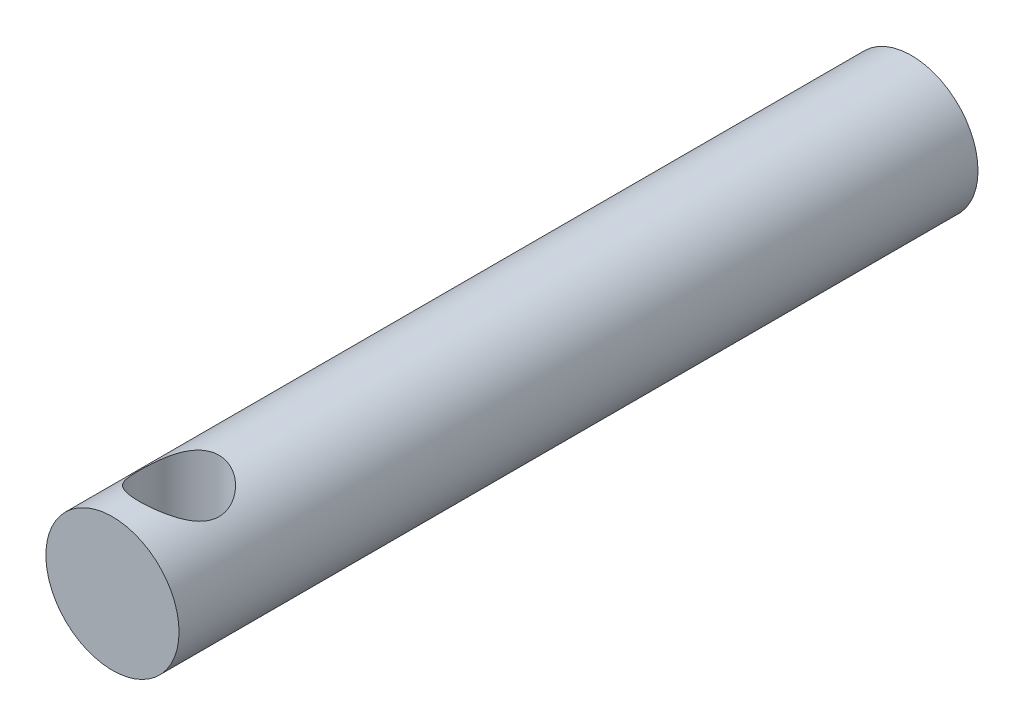
ISO-10303-21;
HEADER;
FILE_DESCRIPTION(('STEP AP214'),'2;1');
FILE_NAME('part.step','',(''),(''),'','','');
FILE_SCHEMA(('AUTOMOTIVE_DESIGN { 1 0 10303 214 1 1 1 1 }'));
ENDSEC;
DATA;
#1=APPLICATION_CONTEXT('core data for automotive mechanical design processes');
#2=APPLICATION_PROTOCOL_DEFINITION('international standard','automotive_design',2000,#1);
#3=PRODUCT_CONTEXT('',#1,'mechanical');
#4=PRODUCT('Part','Part','',(#3));
#5=PRODUCT_RELATED_PRODUCT_CATEGORY('part','',(#4));
#6=PRODUCT_DEFINITION_FORMATION('','',#4);
#7=PRODUCT_DEFINITION_CONTEXT('part definition',#1,'design');
#8=PRODUCT_DEFINITION('design','',#6,#7);
#9=PRODUCT_DEFINITION_SHAPE('','',#8);
#10=(LENGTH_UNIT() NAMED_UNIT(*) SI_UNIT(.MILLI.,.METRE.));
#11=(NAMED_UNIT(*) PLANE_ANGLE_UNIT() SI_UNIT($,.RADIAN.));
#12=(NAMED_UNIT(*) SI_UNIT($,.STERADIAN.) SOLID_ANGLE_UNIT());
#13=UNCERTAINTY_MEASURE_WITH_UNIT(LENGTH_MEASURE(1.E-05),#10,'distance_accuracy_value','');
#14=(GEOMETRIC_REPRESENTATION_CONTEXT(3) GLOBAL_UNCERTAINTY_ASSIGNED_CONTEXT((#13)) GLOBAL_UNIT_ASSIGNED_CONTEXT((#10,
#11,#12)) REPRESENTATION_CONTEXT('',''));
#15=CARTESIAN_POINT('',(0.,0.,0.));
#16=DIRECTION('',(0.,0.,1.));
#17=DIRECTION('',(1.,0.,0.));
#18=AXIS2_PLACEMENT_3D('',#15,#16,#17);
#19=CARTESIAN_POINT('',(0.,0.,30.));
#20=DIRECTION('',(0.,0.,-1.));
#21=DIRECTION('',(-1.,0.,0.));
#22=AXIS2_PLACEMENT_3D('',#19,#20,#21);
#23=CYLINDRICAL_SURFACE('',#22,2.5);
#24=CARTESIAN_POINT('',(0.,-2.5,29.));
#25=CARTESIAN_POINT('',(0.0767298334620157,-2.49999625789732,28.9999959089901));
#26=CARTESIAN_POINT('',(0.153582320644178,-2.4964290461501,28.9940713290737));
#27=CARTESIAN_POINT('',(0.304975509530679,-2.48249903608568,28.9706756804847));
#28=CARTESIAN_POINT('',(0.379510034596047,-2.47211948032719,28.9531761381458));
#29=CARTESIAN_POINT('',(0.523751827790836,-2.44561558054488,28.9076136388331));
#30=CARTESIAN_POINT('',(0.593481028226566,-2.42951973272944,28.8796030418368));
#31=CARTESIAN_POINT('',(0.727030318214659,-2.39295367626407,28.814139666859));
#32=CARTESIAN_POINT('',(0.790851869416383,-2.37248455380255,28.7766892330313));
#33=CARTESIAN_POINT('',(0.916299278999314,-2.32705360719088,28.6902251732914));
#34=CARTESIAN_POINT('',(0.977384020081414,-2.30186792195985,28.6405463046486));
#35=CARTESIAN_POINT('',(1.09088270411891,-2.25030439279634,28.5325327961717));
#36=CARTESIAN_POINT('',(1.14328534948112,-2.22392505153571,28.4741870628127));
#37=CARTESIAN_POINT('',(1.24444996762974,-2.1691106699591,28.3420764895033));
#38=CARTESIAN_POINT('',(1.29197766378809,-2.14082017703649,28.2672982290187));
#39=CARTESIAN_POINT('',(1.37361437764896,-2.08938301412124,28.1091534267569));
#40=CARTESIAN_POINT('',(1.4077451733516,-2.06622802273938,28.0258011037524));
#41=CARTESIAN_POINT('',(1.45440601714222,-2.0335462966093,27.8734035493468));
#42=CARTESIAN_POINT('',(1.47016197246826,-2.02207883137591,27.8057640013897));
#43=CARTESIAN_POINT('',(1.49216172340475,-2.00590308295503,27.6681962841696));
#44=CARTESIAN_POINT('',(1.49841734556836,-2.00118639643759,27.5982710712455));
#45=CARTESIAN_POINT('',(1.50105508796009,-1.99920922463856,27.4579885057827));
#46=CARTESIAN_POINT('',(1.49741783408419,-2.00196337012718,27.3876305749068));
#47=CARTESIAN_POINT('',(1.48046060478828,-2.01453261443741,27.2487212245724));
#48=CARTESIAN_POINT('',(1.46713334620103,-2.02435302432226,27.1801712041526));
#49=CARTESIAN_POINT('',(1.43173921881793,-2.04953186944258,27.0474697578719));
#50=CARTESIAN_POINT('',(1.40978748666087,-2.06481711652537,26.9832729460755));
#51=CARTESIAN_POINT('',(1.35795061770837,-2.09927051350828,26.8593050090719));
#52=CARTESIAN_POINT('',(1.32806257259705,-2.11844008623465,26.7995355165761));
#53=CARTESIAN_POINT('',(1.25517983184583,-2.16255327268985,26.6750159028772));
#54=CARTESIAN_POINT('',(1.21080724397723,-2.18792043372992,26.6112219070451));
#55=CARTESIAN_POINT('',(1.11291092784003,-2.23930599764381,26.491323516333));
#56=CARTESIAN_POINT('',(1.05937845100579,-2.26532500262149,26.4352265660235));
#57=CARTESIAN_POINT('',(0.93581183438297,-2.31935504958317,26.3243870181782));
#58=CARTESIAN_POINT('',(0.864517682704962,-2.34713836268532,26.270922693984));
#59=CARTESIAN_POINT('',(0.712276050459004,-2.3977242843398,26.1768779528021));
#60=CARTESIAN_POINT('',(0.631333763943567,-2.42052955425515,26.13629064621));
#61=CARTESIAN_POINT('',(0.467197585268208,-2.45730392066151,26.0720678172041));
#62=CARTESIAN_POINT('',(0.384467624173582,-2.47173957439704,26.0475246442841));
#63=CARTESIAN_POINT('',(0.215047895144642,-2.4921884281355,26.0129888025946));
#64=CARTESIAN_POINT('',(0.128363005661321,-2.49821172952738,26.0029786822464));
#65=CARTESIAN_POINT('',(-0.0337146143773943,-2.5009057037461,25.9984921523217));
#66=CARTESIAN_POINT('',(-0.109042473418716,-2.49873521714286,26.0020911449148));
#67=CARTESIAN_POINT('',(-0.257829401986059,-2.48778712087048,26.0204258530719));
#68=CARTESIAN_POINT('',(-0.331288509376104,-2.47900964518037,26.0351613428058));
#69=CARTESIAN_POINT('',(-0.472574932157611,-2.4559479244219,26.0745434328125));
#70=CARTESIAN_POINT('',(-0.540495750928483,-2.44180275662555,26.0989403490735));
#71=CARTESIAN_POINT('',(-0.671265749087262,-2.40913880862845,26.1566773763653));
#72=CARTESIAN_POINT('',(-0.734113924963907,-2.39061916586511,26.1900192513467));
#73=CARTESIAN_POINT('',(-0.860006262823861,-2.3484549623736,26.2685569792087));
#74=CARTESIAN_POINT('',(-0.922394150456833,-2.3244780273988,26.3146238290784));
#75=CARTESIAN_POINT('',(-1.03902603131013,-2.27474265574732,26.4153913934886));
#76=CARTESIAN_POINT('',(-1.09326040273738,-2.24898216586361,26.4701021548525));
#77=CARTESIAN_POINT('',(-1.19931996735579,-2.19445423909891,26.5949103900371));
#78=CARTESIAN_POINT('',(-1.24991019630915,-2.16573241746291,26.6660838854655));
#79=CARTESIAN_POINT('',(-1.33845238915667,-2.1121618206671,26.8172160245682));
#80=CARTESIAN_POINT('',(-1.37641766769781,-2.0873089799769,26.8971652938928));
#81=CARTESIAN_POINT('',(-1.43142578795776,-2.04984909240519,27.0462430223067));
#82=CARTESIAN_POINT('',(-1.4512162533619,-2.03575659328728,27.1139803123586));
#83=CARTESIAN_POINT('',(-1.48113663905972,-2.01409605743544,27.2525320780801));
#84=CARTESIAN_POINT('',(-1.49127995297631,-2.00651897642721,27.3233421443278));
#85=CARTESIAN_POINT('',(-1.50134130416631,-1.99900446616267,27.466376947597));
#86=CARTESIAN_POINT('',(-1.50122089107869,-1.99909576445937,27.538605990687));
#87=CARTESIAN_POINT('',(-1.49066472959328,-2.0069771789285,27.6818944356095));
#88=CARTESIAN_POINT('',(-1.48022337215759,-2.0147714813882,27.7529531800806));
#89=CARTESIAN_POINT('',(-1.45040174148913,-2.0363318524298,27.8884884175722));
#90=CARTESIAN_POINT('',(-1.43147636845351,-2.04979211805581,27.9531170943069));
#91=CARTESIAN_POINT('',(-1.38563242076993,-2.08105501960151,28.0783372544742));
#92=CARTESIAN_POINT('',(-1.35871083588479,-2.09885929040482,28.1389272069606));
#93=CARTESIAN_POINT('',(-1.29289245555732,-2.14012990550917,28.2643198572208));
#94=CARTESIAN_POINT('',(-1.25279167675753,-2.16404587582639,28.3283411038543));
#95=CARTESIAN_POINT('',(-1.16375698389084,-2.21320127030768,28.4493800726173));
#96=CARTESIAN_POINT('',(-1.11481579607798,-2.23844177205021,28.5063919621526));
#97=CARTESIAN_POINT('',(-1.00009777425734,-2.29225690291477,28.6213509491317));
#98=CARTESIAN_POINT('',(-0.932876819313902,-2.32070308663658,28.6779310748962));
#99=CARTESIAN_POINT('',(-0.788462434445587,-2.37365428872367,28.7790978558633));
#100=CARTESIAN_POINT('',(-0.711265444501538,-2.39815789310936,28.8236802119848));
#101=CARTESIAN_POINT('',(-0.551125230801451,-2.43985578654394,28.8977858075737));
#102=CARTESIAN_POINT('',(-0.468430086957211,-2.45725077479787,28.9277280649268));
#103=CARTESIAN_POINT('',(-0.297973306118805,-2.48366273001246,28.972724695211));
#104=CARTESIAN_POINT('',(-0.21023209964861,-2.49271125871485,28.987835167857));
#105=CARTESIAN_POINT('',(-0.101558096917534,-2.49802001168187,28.9966974547087));
#106=CARTESIAN_POINT('',(-0.0812762590282759,-2.49876114656362,28.9979344173061));
#107=CARTESIAN_POINT('',(-0.0406658206871115,-2.49975164517367,28.9995862463709));
#108=CARTESIAN_POINT('',(-0.020337218637569,-2.50000099184316,29.0000010843209));
#109=CARTESIAN_POINT('',(0.,-2.5,29.));
#110=B_SPLINE_CURVE_WITH_KNOTS('',3,(#24,#25,#26,#27,#28,#29,#30,#31,#32,#33,#34,#35,#36,#37,
#38,#39,#40,#41,#42,#43,#44,#45,#46,#47,#48,#49,#50,#51,#52,#53,#54,#55,#56,#57,#58,#59,#60,#61,
#62,#63,#64,#65,#66,#67,#68,#69,#70,#71,#72,#73,#74,#75,#76,#77,#78,#79,#80,#81,#82,#83,#84,#85,
#86,#87,#88,#89,#90,#91,#92,#93,#94,#95,#96,#97,#98,#99,#100,#101,#102,#103,#104,#105,#106,#107,
#108,#109),.UNSPECIFIED.,.T.,.F.,(4,2,2,2,2,2,2,2,2,2,2,2,2,2,2,2,2,2,2,2,2,2,2,2,2,2,2,2,2,2,2,
2,2,2,2,2,2,2,2,2,2,2,4),(0.,0.230102237548649,0.460772627520012,0.690308884600011,
0.919788197992275,1.16681590732472,1.414162579348,1.69183813189807,1.96906040692091,
2.17933829855633,2.38935420916578,2.59978170870726,2.81036753273872,3.01823267593207,
3.22617409809868,3.47046995225163,3.71500044803674,3.99360957884691,4.27206939275324,
4.53296790696559,4.79355286918236,5.01875602722426,5.24395461863455,5.46367785689772,
5.68344445659025,5.92601365818361,6.16886690081836,6.44336762428009,6.71757792616456,
6.93257787314692,7.14727888733319,7.36278425777433,7.57840681155725,7.78364098331142,
7.98895251523035,8.22578610052286,8.46281544370208,8.73854311775519,9.01436946031985,
9.28175654462677,9.54812832184449,9.60911473335177,9.67010326027641),.UNSPECIFIED.);
#111=CARTESIAN_POINT('',(0.,-2.5,29.));
#112=VERTEX_POINT('',#111);
#113=EDGE_CURVE('E10',#112,#112,#110,.T.);
#114=ORIENTED_EDGE('',*,*,#113,.T.);
#115=EDGE_LOOP('',(#114));
#116=FACE_BOUND('',#115,.T.);
#117=CARTESIAN_POINT('',(0.,2.5,29.));
#118=CARTESIAN_POINT('',(-0.0767298334620157,2.49999625789732,28.9999959089901));
#119=CARTESIAN_POINT('',(-0.153582320644178,2.4964290461501,28.9940713290737));
#120=CARTESIAN_POINT('',(-0.304975509530679,2.48249903608568,28.9706756804847));
#121=CARTESIAN_POINT('',(-0.379510034596047,2.47211948032719,28.9531761381458));
#122=CARTESIAN_POINT('',(-0.523751827790836,2.44561558054488,28.9076136388331));
#123=CARTESIAN_POINT('',(-0.593481028226566,2.42951973272944,28.8796030418368));
#124=CARTESIAN_POINT('',(-0.727030318214659,2.39295367626407,28.814139666859));
#125=CARTESIAN_POINT('',(-0.790851869416383,2.37248455380255,28.7766892330313));
#126=CARTESIAN_POINT('',(-0.916299278999314,2.32705360719088,28.6902251732914));
#127=CARTESIAN_POINT('',(-0.977384020081414,2.30186792195985,28.6405463046486));
#128=CARTESIAN_POINT('',(-1.09088270411891,2.25030439279634,28.5325327961717));
#129=CARTESIAN_POINT('',(-1.14328534948112,2.22392505153571,28.4741870628127));
#130=CARTESIAN_POINT('',(-1.24444996762974,2.1691106699591,28.3420764895033));
#131=CARTESIAN_POINT('',(-1.29197766378809,2.14082017703649,28.2672982290187));
#132=CARTESIAN_POINT('',(-1.37361437764896,2.08938301412124,28.1091534267569));
#133=CARTESIAN_POINT('',(-1.4077451733516,2.06622802273938,28.0258011037524));
#134=CARTESIAN_POINT('',(-1.45440601714222,2.0335462966093,27.8734035493468));
#135=CARTESIAN_POINT('',(-1.47016197246826,2.02207883137591,27.8057640013897));
#136=CARTESIAN_POINT('',(-1.49216172340475,2.00590308295503,27.6681962841696));
#137=CARTESIAN_POINT('',(-1.49841734556836,2.00118639643759,27.5982710712455));
#138=CARTESIAN_POINT('',(-1.50105508796009,1.99920922463856,27.4579885057827));
#139=CARTESIAN_POINT('',(-1.49741783408419,2.00196337012718,27.3876305749068));
#140=CARTESIAN_POINT('',(-1.48046060478828,2.01453261443741,27.2487212245724));
#141=CARTESIAN_POINT('',(-1.46713334620103,2.02435302432226,27.1801712041526));
#142=CARTESIAN_POINT('',(-1.43173921881793,2.04953186944258,27.0474697578719));
#143=CARTESIAN_POINT('',(-1.40978748666087,2.06481711652537,26.9832729460755));
#144=CARTESIAN_POINT('',(-1.35795061770837,2.09927051350828,26.8593050090719));
#145=CARTESIAN_POINT('',(-1.32806257259705,2.11844008623465,26.7995355165761));
#146=CARTESIAN_POINT('',(-1.25517983184583,2.16255327268985,26.6750159028772));
#147=CARTESIAN_POINT('',(-1.21080724397723,2.18792043372992,26.6112219070451));
#148=CARTESIAN_POINT('',(-1.11291092784003,2.23930599764381,26.491323516333));
#149=CARTESIAN_POINT('',(-1.05937845100579,2.26532500262149,26.4352265660235));
#150=CARTESIAN_POINT('',(-0.93581183438297,2.31935504958317,26.3243870181782));
#151=CARTESIAN_POINT('',(-0.864517682704962,2.34713836268532,26.270922693984));
#152=CARTESIAN_POINT('',(-0.712276050459004,2.3977242843398,26.1768779528021));
#153=CARTESIAN_POINT('',(-0.631333763943567,2.42052955425515,26.13629064621));
#154=CARTESIAN_POINT('',(-0.467197585268208,2.45730392066151,26.0720678172041));
#155=CARTESIAN_POINT('',(-0.384467624173582,2.47173957439704,26.0475246442841));
#156=CARTESIAN_POINT('',(-0.215047895144642,2.4921884281355,26.0129888025946));
#157=CARTESIAN_POINT('',(-0.128363005661321,2.49821172952738,26.0029786822464));
#158=CARTESIAN_POINT('',(0.0337146143773943,2.5009057037461,25.9984921523217));
#159=CARTESIAN_POINT('',(0.109042473418716,2.49873521714286,26.0020911449148));
#160=CARTESIAN_POINT('',(0.257829401986059,2.48778712087048,26.0204258530719));
#161=CARTESIAN_POINT('',(0.331288509376104,2.47900964518037,26.0351613428058));
#162=CARTESIAN_POINT('',(0.472574932157611,2.4559479244219,26.0745434328125));
#163=CARTESIAN_POINT('',(0.540495750928483,2.44180275662555,26.0989403490735));
#164=CARTESIAN_POINT('',(0.671265749087262,2.40913880862845,26.1566773763653));
#165=CARTESIAN_POINT('',(0.734113924963907,2.39061916586511,26.1900192513467));
#166=CARTESIAN_POINT('',(0.860006262823861,2.3484549623736,26.2685569792087));
#167=CARTESIAN_POINT('',(0.922394150456833,2.3244780273988,26.3146238290784));
#168=CARTESIAN_POINT('',(1.03902603131013,2.27474265574732,26.4153913934886));
#169=CARTESIAN_POINT('',(1.09326040273738,2.24898216586361,26.4701021548525));
#170=CARTESIAN_POINT('',(1.19931996735579,2.19445423909891,26.5949103900371));
#171=CARTESIAN_POINT('',(1.24991019630915,2.16573241746291,26.6660838854655));
#172=CARTESIAN_POINT('',(1.33845238915667,2.1121618206671,26.8172160245682));
#173=CARTESIAN_POINT('',(1.37641766769781,2.0873089799769,26.8971652938928));
#174=CARTESIAN_POINT('',(1.43142578795776,2.04984909240519,27.0462430223067));
#175=CARTESIAN_POINT('',(1.4512162533619,2.03575659328728,27.1139803123586));
#176=CARTESIAN_POINT('',(1.48113663905972,2.01409605743544,27.2525320780801));
#177=CARTESIAN_POINT('',(1.49127995297631,2.00651897642721,27.3233421443278));
#178=CARTESIAN_POINT('',(1.50134130416631,1.99900446616267,27.466376947597));
#179=CARTESIAN_POINT('',(1.50122089107869,1.99909576445937,27.538605990687));
#180=CARTESIAN_POINT('',(1.49066472959328,2.0069771789285,27.6818944356095));
#181=CARTESIAN_POINT('',(1.48022337215759,2.0147714813882,27.7529531800806));
#182=CARTESIAN_POINT('',(1.45040174148913,2.0363318524298,27.8884884175722));
#183=CARTESIAN_POINT('',(1.43147636845351,2.04979211805581,27.9531170943069));
#184=CARTESIAN_POINT('',(1.38563242076993,2.08105501960151,28.0783372544742));
#185=CARTESIAN_POINT('',(1.35871083588479,2.09885929040482,28.1389272069606));
#186=CARTESIAN_POINT('',(1.29289245555732,2.14012990550917,28.2643198572208));
#187=CARTESIAN_POINT('',(1.25279167675753,2.16404587582639,28.3283411038543));
#188=CARTESIAN_POINT('',(1.16375698389084,2.21320127030768,28.4493800726173));
#189=CARTESIAN_POINT('',(1.11481579607798,2.23844177205021,28.5063919621526));
#190=CARTESIAN_POINT('',(1.00009777425734,2.29225690291477,28.6213509491317));
#191=CARTESIAN_POINT('',(0.932876819313902,2.32070308663658,28.6779310748962));
#192=CARTESIAN_POINT('',(0.788462434445587,2.37365428872367,28.7790978558633));
#193=CARTESIAN_POINT('',(0.711265444501538,2.39815789310936,28.8236802119848));
#194=CARTESIAN_POINT('',(0.551125230801451,2.43985578654394,28.8977858075737));
#195=CARTESIAN_POINT('',(0.468430086957211,2.45725077479787,28.9277280649268));
#196=CARTESIAN_POINT('',(0.297973306118805,2.48366273001246,28.972724695211));
#197=CARTESIAN_POINT('',(0.21023209964861,2.49271125871485,28.987835167857));
#198=CARTESIAN_POINT('',(0.101558096917534,2.49802001168187,28.9966974547087));
#199=CARTESIAN_POINT('',(0.0812762590282759,2.49876114656362,28.9979344173061));
#200=CARTESIAN_POINT('',(0.0406658206871115,2.49975164517367,28.9995862463709));
#201=CARTESIAN_POINT('',(0.020337218637569,2.50000099184316,29.0000010843209));
#202=CARTESIAN_POINT('',(0.,2.5,29.));
#203=B_SPLINE_CURVE_WITH_KNOTS('',3,(#117,#118,#119,#120,#121,#122,#123,#124,#125,#126,#127,
#128,#129,#130,#131,#132,#133,#134,#135,#136,#137,#138,#139,#140,#141,#142,#143,#144,#145,#146,
#147,#148,#149,#150,#151,#152,#153,#154,#155,#156,#157,#158,#159,#160,#161,#162,#163,#164,#165,
#166,#167,#168,#169,#170,#171,#172,#173,#174,#175,#176,#177,#178,#179,#180,#181,#182,#183,#184,
#185,#186,#187,#188,#189,#190,#191,#192,#193,#194,#195,#196,#197,#198,#199,#200,#201,#202),
.UNSPECIFIED.,.T.,.F.,(4,2,2,2,2,2,2,2,2,2,2,2,2,2,2,2,2,2,2,2,2,2,2,2,2,2,2,2,2,2,2,2,2,2,2,2,
2,2,2,2,2,2,4),(0.,0.230102237548649,0.460772627520012,0.690308884600011,0.919788197992275,
1.16681590732472,1.414162579348,1.69183813189807,1.96906040692091,2.17933829855633,
2.38935420916578,2.59978170870726,2.81036753273872,3.01823267593207,3.22617409809868,
3.47046995225163,3.71500044803674,3.99360957884691,4.27206939275324,4.53296790696559,
4.79355286918236,5.01875602722426,5.24395461863455,5.46367785689772,5.68344445659025,
5.92601365818361,6.16886690081836,6.44336762428009,6.71757792616456,6.93257787314692,
7.14727888733319,7.36278425777433,7.57840681155725,7.78364098331142,7.98895251523035,
8.22578610052286,8.46281544370208,8.73854311775519,9.01436946031985,9.28175654462677,
9.54812832184449,9.60911473335177,9.67010326027641),.UNSPECIFIED.);
#204=CARTESIAN_POINT('',(0.,2.5,29.));
#205=VERTEX_POINT('',#204);
#206=EDGE_CURVE('E47',#205,#205,#203,.T.);
#207=ORIENTED_EDGE('',*,*,#206,.T.);
#208=EDGE_LOOP('',(#207));
#209=FACE_BOUND('',#208,.T.);
#210=CARTESIAN_POINT('',(0.,0.,30.));
#211=DIRECTION('',(0.,0.,1.));
#212=DIRECTION('',(1.,0.,0.));
#213=AXIS2_PLACEMENT_3D('',#210,#211,#212);
#214=CIRCLE('',#213,2.5);
#215=CARTESIAN_POINT('',(2.5,0.,30.));
#216=VERTEX_POINT('',#215);
#217=EDGE_CURVE('E51',#216,#216,#214,.T.);
#218=ORIENTED_EDGE('',*,*,#217,.F.);
#219=EDGE_LOOP('',(#218));
#220=FACE_BOUND('',#219,.T.);
#221=CARTESIAN_POINT('',(0.,0.,0.));
#222=DIRECTION('',(0.,0.,1.));
#223=DIRECTION('',(1.,0.,0.));
#224=AXIS2_PLACEMENT_3D('',#221,#222,#223);
#225=CIRCLE('',#224,2.5);
#226=CARTESIAN_POINT('',(2.5,0.,0.));
#227=VERTEX_POINT('',#226);
#228=EDGE_CURVE('E55',#227,#227,#225,.T.);
#229=ORIENTED_EDGE('',*,*,#228,.T.);
#230=EDGE_LOOP('',(#229));
#231=FACE_BOUND('',#230,.T.);
#232=ADVANCED_FACE('F36',(#116,#209,#220,#231),#23,.T.);
#233=CARTESIAN_POINT('',(0.,0.,30.));
#234=DIRECTION('',(0.,0.,1.));
#235=DIRECTION('',(1.,0.,0.));
#236=AXIS2_PLACEMENT_3D('',#233,#234,#235);
#237=PLANE('',#236);
#238=ORIENTED_EDGE('',*,*,#217,.T.);
#239=EDGE_LOOP('',(#238));
#240=FACE_BOUND('',#239,.T.);
#241=ADVANCED_FACE('F67',(#240),#237,.T.);
#242=CARTESIAN_POINT('',(0.,0.,0.));
#243=DIRECTION('',(0.,0.,1.));
#244=DIRECTION('',(1.,0.,0.));
#245=AXIS2_PLACEMENT_3D('',#242,#243,#244);
#246=PLANE('',#245);
#247=ORIENTED_EDGE('',*,*,#228,.F.);
#248=EDGE_LOOP('',(#247));
#249=FACE_BOUND('',#248,.T.);
#250=ADVANCED_FACE('F65',(#249),#246,.F.);
#251=CARTESIAN_POINT('',(0.,-2.5,27.5));
#252=DIRECTION('',(0.,1.,0.));
#253=DIRECTION('',(0.,0.,1.));
#254=AXIS2_PLACEMENT_3D('',#251,#252,#253);
#255=CYLINDRICAL_SURFACE('',#254,1.5);
#256=ORIENTED_EDGE('',*,*,#206,.F.);
#257=EDGE_LOOP('',(#256));
#258=FACE_BOUND('',#257,.T.);
#259=ORIENTED_EDGE('',*,*,#113,.F.);
#260=EDGE_LOOP('',(#259));
#261=FACE_BOUND('',#260,.T.);
#262=ADVANCED_FACE('F61',(#258,#261),#255,.F.);
#263=CLOSED_SHELL('',(#232,#241,#250,#262));
#264=MANIFOLD_SOLID_BREP('B2',#263);
#265=ADVANCED_BREP_SHAPE_REPRESENTATION('',(#18,#264),#14);
#266=SHAPE_DEFINITION_REPRESENTATION(#9,#265);
ENDSEC;
END-ISO-10303-21;
